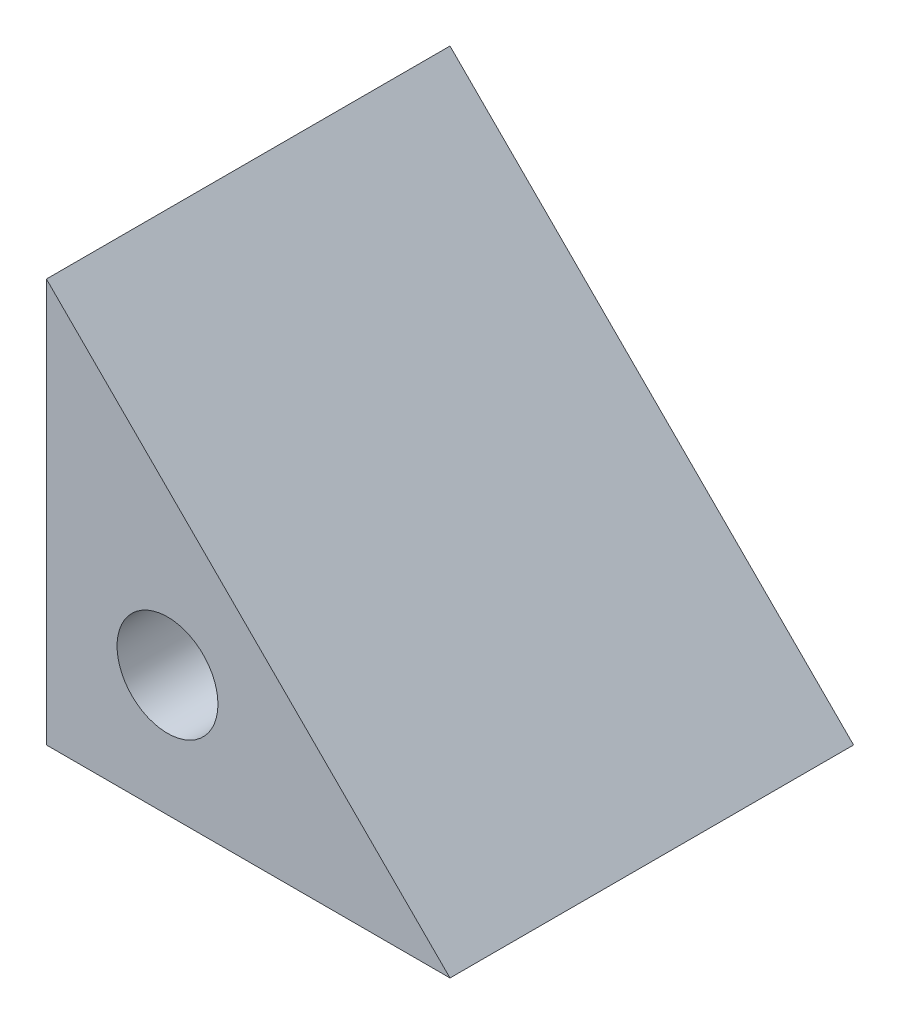
ISO-10303-21;
HEADER;
FILE_DESCRIPTION(('STEP AP214'),'2;1');
FILE_NAME('part.step','',(''),(''),'','','');
FILE_SCHEMA(('AUTOMOTIVE_DESIGN { 1 0 10303 214 1 1 1 1 }'));
ENDSEC;
DATA;
#1=APPLICATION_CONTEXT('core data for automotive mechanical design processes');
#2=APPLICATION_PROTOCOL_DEFINITION('international standard','automotive_design',2000,#1);
#3=PRODUCT_CONTEXT('',#1,'mechanical');
#4=PRODUCT('Part','Part','',(#3));
#5=PRODUCT_RELATED_PRODUCT_CATEGORY('part','',(#4));
#6=PRODUCT_DEFINITION_FORMATION('','',#4);
#7=PRODUCT_DEFINITION_CONTEXT('part definition',#1,'design');
#8=PRODUCT_DEFINITION('design','',#6,#7);
#9=PRODUCT_DEFINITION_SHAPE('','',#8);
#10=(LENGTH_UNIT() NAMED_UNIT(*) SI_UNIT(.MILLI.,.METRE.));
#11=(NAMED_UNIT(*) PLANE_ANGLE_UNIT() SI_UNIT($,.RADIAN.));
#12=(NAMED_UNIT(*) SI_UNIT($,.STERADIAN.) SOLID_ANGLE_UNIT());
#13=UNCERTAINTY_MEASURE_WITH_UNIT(LENGTH_MEASURE(1.E-05),#10,'distance_accuracy_value','');
#14=(GEOMETRIC_REPRESENTATION_CONTEXT(3) GLOBAL_UNCERTAINTY_ASSIGNED_CONTEXT((#13)) GLOBAL_UNIT_ASSIGNED_CONTEXT((#10,
#11,#12)) REPRESENTATION_CONTEXT('',''));
#15=CARTESIAN_POINT('',(0.,0.,0.));
#16=DIRECTION('',(0.,0.,1.));
#17=DIRECTION('',(1.,0.,0.));
#18=AXIS2_PLACEMENT_3D('',#15,#16,#17);
#19=CARTESIAN_POINT('',(0.,0.,40.));
#20=DIRECTION('',(0.,0.,-1.));
#21=DIRECTION('',(-1.,0.,0.));
#22=AXIS2_PLACEMENT_3D('',#19,#20,#21);
#23=PLANE('',#22);
#24=DIRECTION('',(1.,0.,0.));
#25=VECTOR('',#24,1.);
#26=CARTESIAN_POINT('',(40.,0.,40.));
#27=LINE('',#26,#25);
#28=CARTESIAN_POINT('',(0.,0.,40.));
#29=VERTEX_POINT('',#28);
#30=CARTESIAN_POINT('',(40.,0.,40.));
#31=VERTEX_POINT('',#30);
#32=EDGE_CURVE('E76',#29,#31,#27,.T.);
#33=ORIENTED_EDGE('',*,*,#32,.T.);
#34=DIRECTION('',(-0.707106781186548,0.707106781186548,0.));
#35=VECTOR('',#34,1.);
#36=CARTESIAN_POINT('',(0.,40.,40.));
#37=LINE('',#36,#35);
#38=CARTESIAN_POINT('',(0.,40.,40.));
#39=VERTEX_POINT('',#38);
#40=EDGE_CURVE('E72',#31,#39,#37,.T.);
#41=ORIENTED_EDGE('',*,*,#40,.T.);
#42=DIRECTION('',(0.,-1.,0.));
#43=VECTOR('',#42,1.);
#44=CARTESIAN_POINT('',(0.,0.,40.));
#45=LINE('',#44,#43);
#46=EDGE_CURVE('E52',#39,#29,#45,.T.);
#47=ORIENTED_EDGE('',*,*,#46,.T.);
#48=EDGE_LOOP('',(#33,#41,#47));
#49=FACE_BOUND('',#48,.T.);
#50=CARTESIAN_POINT('',(12.,12.,40.));
#51=DIRECTION('',(0.,0.,1.));
#52=DIRECTION('',(1.,0.,0.));
#53=AXIS2_PLACEMENT_3D('',#50,#51,#52);
#54=CIRCLE('',#53,5.);
#55=CARTESIAN_POINT('',(17.,12.,40.));
#56=VERTEX_POINT('',#55);
#57=EDGE_CURVE('E86',#56,#56,#54,.T.);
#58=ORIENTED_EDGE('',*,*,#57,.F.);
#59=EDGE_LOOP('',(#58));
#60=FACE_BOUND('',#59,.T.);
#61=ADVANCED_FACE('F35',(#49,#60),#23,.F.);
#62=CARTESIAN_POINT('',(0.,0.,0.));
#63=DIRECTION('',(0.,0.,-1.));
#64=DIRECTION('',(-1.,0.,0.));
#65=AXIS2_PLACEMENT_3D('',#62,#63,#64);
#66=PLANE('',#65);
#67=DIRECTION('',(1.,0.,0.));
#68=VECTOR('',#67,1.);
#69=CARTESIAN_POINT('',(40.,0.,0.));
#70=LINE('',#69,#68);
#71=CARTESIAN_POINT('',(0.,0.,0.));
#72=VERTEX_POINT('',#71);
#73=CARTESIAN_POINT('',(40.,0.,0.));
#74=VERTEX_POINT('',#73);
#75=EDGE_CURVE('E83',#72,#74,#70,.T.);
#76=ORIENTED_EDGE('',*,*,#75,.F.);
#77=DIRECTION('',(0.,-1.,0.));
#78=VECTOR('',#77,1.);
#79=CARTESIAN_POINT('',(0.,0.,0.));
#80=LINE('',#79,#78);
#81=CARTESIAN_POINT('',(0.,40.,0.));
#82=VERTEX_POINT('',#81);
#83=EDGE_CURVE('E69',#82,#72,#80,.T.);
#84=ORIENTED_EDGE('',*,*,#83,.F.);
#85=DIRECTION('',(-0.707106781186548,0.707106781186548,0.));
#86=VECTOR('',#85,1.);
#87=CARTESIAN_POINT('',(0.,40.,0.));
#88=LINE('',#87,#86);
#89=EDGE_CURVE('E64',#74,#82,#88,.T.);
#90=ORIENTED_EDGE('',*,*,#89,.F.);
#91=EDGE_LOOP('',(#76,#84,#90));
#92=FACE_BOUND('',#91,.T.);
#93=CARTESIAN_POINT('',(12.,12.,0.));
#94=DIRECTION('',(0.,0.,1.));
#95=DIRECTION('',(1.,0.,0.));
#96=AXIS2_PLACEMENT_3D('',#93,#94,#95);
#97=CIRCLE('',#96,5.);
#98=CARTESIAN_POINT('',(17.,12.,0.));
#99=VERTEX_POINT('',#98);
#100=EDGE_CURVE('E90',#99,#99,#97,.T.);
#101=ORIENTED_EDGE('',*,*,#100,.T.);
#102=EDGE_LOOP('',(#101));
#103=FACE_BOUND('',#102,.T.);
#104=ADVANCED_FACE('F96',(#92,#103),#66,.T.);
#105=CARTESIAN_POINT('',(40.,0.,40.));
#106=DIRECTION('',(0.,1.,0.));
#107=DIRECTION('',(-1.,0.,0.));
#108=AXIS2_PLACEMENT_3D('',#105,#106,#107);
#109=PLANE('',#108);
#110=ORIENTED_EDGE('',*,*,#75,.T.);
#111=DIRECTION('',(0.,0.,-1.));
#112=VECTOR('',#111,1.);
#113=CARTESIAN_POINT('',(40.,0.,40.));
#114=LINE('',#113,#112);
#115=EDGE_CURVE('E11',#31,#74,#114,.T.);
#116=ORIENTED_EDGE('',*,*,#115,.F.);
#117=ORIENTED_EDGE('',*,*,#32,.F.);
#118=DIRECTION('',(0.,0.,-1.));
#119=VECTOR('',#118,1.);
#120=CARTESIAN_POINT('',(0.,0.,40.));
#121=LINE('',#120,#119);
#122=EDGE_CURVE('E84',#29,#72,#121,.T.);
#123=ORIENTED_EDGE('',*,*,#122,.T.);
#124=EDGE_LOOP('',(#110,#116,#117,#123));
#125=FACE_BOUND('',#124,.T.);
#126=ADVANCED_FACE('F37',(#125),#109,.F.);
#127=CARTESIAN_POINT('',(0.,40.,40.));
#128=DIRECTION('',(-0.707106781186548,-0.707106781186548,0.));
#129=DIRECTION('',(0.707106781186548,-0.707106781186548,0.));
#130=AXIS2_PLACEMENT_3D('',#127,#128,#129);
#131=PLANE('',#130);
#132=ORIENTED_EDGE('',*,*,#89,.T.);
#133=DIRECTION('',(0.,0.,-1.));
#134=VECTOR('',#133,1.);
#135=CARTESIAN_POINT('',(0.,40.,40.));
#136=LINE('',#135,#134);
#137=EDGE_CURVE('E44',#39,#82,#136,.T.);
#138=ORIENTED_EDGE('',*,*,#137,.F.);
#139=ORIENTED_EDGE('',*,*,#40,.F.);
#140=ORIENTED_EDGE('',*,*,#115,.T.);
#141=EDGE_LOOP('',(#132,#138,#139,#140));
#142=FACE_BOUND('',#141,.T.);
#143=ADVANCED_FACE('F73',(#142),#131,.F.);
#144=CARTESIAN_POINT('',(0.,0.,40.));
#145=DIRECTION('',(1.,0.,0.));
#146=DIRECTION('',(0.,0.,-1.));
#147=AXIS2_PLACEMENT_3D('',#144,#145,#146);
#148=PLANE('',#147);
#149=ORIENTED_EDGE('',*,*,#83,.T.);
#150=ORIENTED_EDGE('',*,*,#122,.F.);
#151=ORIENTED_EDGE('',*,*,#46,.F.);
#152=ORIENTED_EDGE('',*,*,#137,.T.);
#153=EDGE_LOOP('',(#149,#150,#151,#152));
#154=FACE_BOUND('',#153,.T.);
#155=ADVANCED_FACE('F95',(#154),#148,.F.);
#156=CARTESIAN_POINT('',(12.,12.,40.));
#157=DIRECTION('',(0.,0.,-1.));
#158=DIRECTION('',(-1.,0.,0.));
#159=AXIS2_PLACEMENT_3D('',#156,#157,#158);
#160=CYLINDRICAL_SURFACE('',#159,5.);
#161=ORIENTED_EDGE('',*,*,#57,.T.);
#162=EDGE_LOOP('',(#161));
#163=FACE_BOUND('',#162,.T.);
#164=ORIENTED_EDGE('',*,*,#100,.F.);
#165=EDGE_LOOP('',(#164));
#166=FACE_BOUND('',#165,.T.);
#167=ADVANCED_FACE('F104',(#163,#166),#160,.F.);
#168=CLOSED_SHELL('',(#61,#104,#126,#143,#155,#167));
#169=MANIFOLD_SOLID_BREP('B2',#168);
#170=ADVANCED_BREP_SHAPE_REPRESENTATION('',(#18,#169),#14);
#171=SHAPE_DEFINITION_REPRESENTATION(#9,#170);
ENDSEC;
END-ISO-10303-21;
